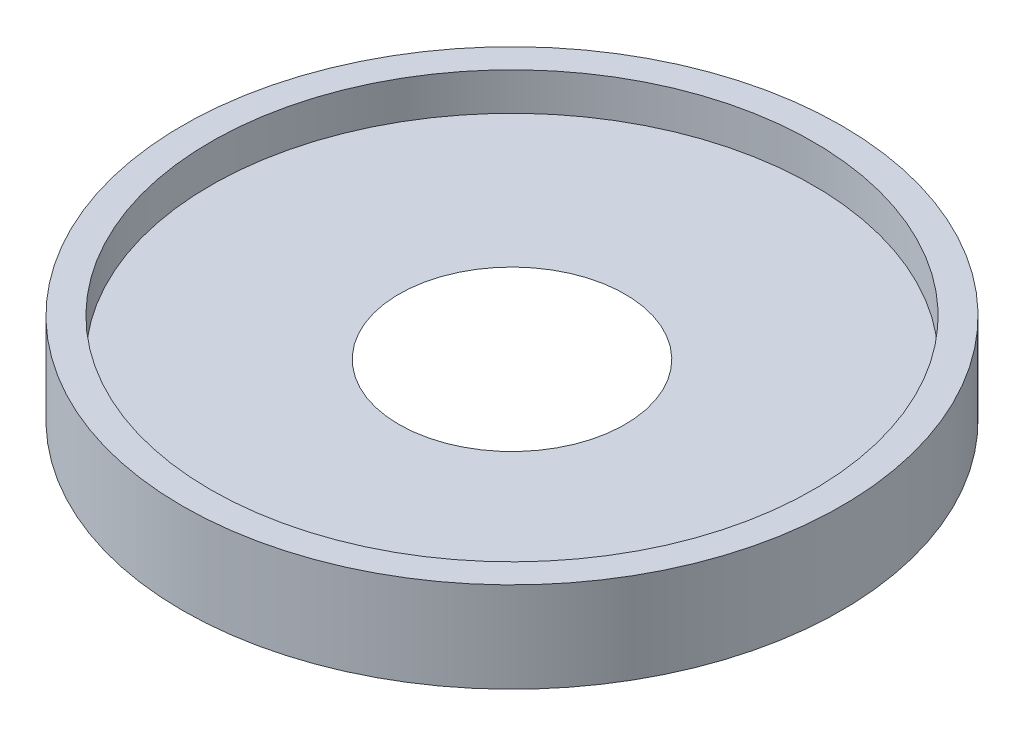
ISO-10303-21;
HEADER;
FILE_DESCRIPTION(('STEP AP214'),'2;1');
FILE_NAME('part.step','',(''),(''),'','','');
FILE_SCHEMA(('AUTOMOTIVE_DESIGN { 1 0 10303 214 1 1 1 1 }'));
ENDSEC;
DATA;
#1=APPLICATION_CONTEXT('core data for automotive mechanical design processes');
#2=APPLICATION_PROTOCOL_DEFINITION('international standard','automotive_design',2000,#1);
#3=PRODUCT_CONTEXT('',#1,'mechanical');
#4=PRODUCT('Part','Part','',(#3));
#5=PRODUCT_RELATED_PRODUCT_CATEGORY('part','',(#4));
#6=PRODUCT_DEFINITION_FORMATION('','',#4);
#7=PRODUCT_DEFINITION_CONTEXT('part definition',#1,'design');
#8=PRODUCT_DEFINITION('design','',#6,#7);
#9=PRODUCT_DEFINITION_SHAPE('','',#8);
#10=(LENGTH_UNIT() NAMED_UNIT(*) SI_UNIT(.MILLI.,.METRE.));
#11=(NAMED_UNIT(*) PLANE_ANGLE_UNIT() SI_UNIT($,.RADIAN.));
#12=(NAMED_UNIT(*) SI_UNIT($,.STERADIAN.) SOLID_ANGLE_UNIT());
#13=UNCERTAINTY_MEASURE_WITH_UNIT(LENGTH_MEASURE(1.E-05),#10,'distance_accuracy_value','');
#14=(GEOMETRIC_REPRESENTATION_CONTEXT(3) GLOBAL_UNCERTAINTY_ASSIGNED_CONTEXT((#13)) GLOBAL_UNIT_ASSIGNED_CONTEXT((#10,
#11,#12)) REPRESENTATION_CONTEXT('',''));
#15=CARTESIAN_POINT('',(0.,0.,0.));
#16=DIRECTION('',(0.,0.,1.));
#17=DIRECTION('',(1.,0.,0.));
#18=AXIS2_PLACEMENT_3D('',#15,#16,#17);
#19=CARTESIAN_POINT('',(0.,3.048,0.));
#20=DIRECTION('',(0.,-1.,0.));
#21=DIRECTION('',(0.,0.,-1.));
#22=AXIS2_PLACEMENT_3D('',#19,#20,#21);
#23=CYLINDRICAL_SURFACE('',#22,11.1125);
#24=CARTESIAN_POINT('',(0.,3.048,0.));
#25=DIRECTION('',(0.,1.,0.));
#26=DIRECTION('',(0.,0.,1.));
#27=AXIS2_PLACEMENT_3D('',#24,#25,#26);
#28=CIRCLE('',#27,11.1125);
#29=CARTESIAN_POINT('',(0.,3.048,-11.1125));
#30=VERTEX_POINT('',#29);
#31=EDGE_CURVE('E41',#30,#30,#28,.T.);
#32=CARTESIAN_POINT('',(0.,0.,0.));
#33=DIRECTION('',(0.,1.,0.));
#34=DIRECTION('',(0.,0.,1.));
#35=AXIS2_PLACEMENT_3D('',#32,#33,#34);
#36=CIRCLE('',#35,11.1125);
#37=CARTESIAN_POINT('',(0.,0.,-11.1125));
#38=VERTEX_POINT('',#37);
#39=EDGE_CURVE('E45',#38,#38,#36,.T.);
#40=CARTESIAN_POINT('',(0.,3.048,-11.1125));
#41=CARTESIAN_POINT('',(0.,3.01625,-11.1125));
#42=CARTESIAN_POINT('',(0.,2.9845,-11.1125));
#43=CARTESIAN_POINT('',(0.,2.921,-11.1125));
#44=CARTESIAN_POINT('',(0.,2.88925,-11.1125));
#45=CARTESIAN_POINT('',(0.,2.82575,-11.1125));
#46=CARTESIAN_POINT('',(0.,2.794,-11.1125));
#47=CARTESIAN_POINT('',(0.,2.7305,-11.1125));
#48=CARTESIAN_POINT('',(0.,2.69875,-11.1125));
#49=CARTESIAN_POINT('',(0.,2.63525,-11.1125));
#50=CARTESIAN_POINT('',(0.,2.6035,-11.1125));
#51=CARTESIAN_POINT('',(0.,2.54,-11.1125));
#52=CARTESIAN_POINT('',(0.,2.50825,-11.1125));
#53=CARTESIAN_POINT('',(0.,2.44475,-11.1125));
#54=CARTESIAN_POINT('',(0.,2.413,-11.1125));
#55=CARTESIAN_POINT('',(0.,2.3495,-11.1125));
#56=CARTESIAN_POINT('',(0.,2.31775,-11.1125));
#57=CARTESIAN_POINT('',(0.,2.25425,-11.1125));
#58=CARTESIAN_POINT('',(0.,2.2225,-11.1125));
#59=CARTESIAN_POINT('',(0.,2.159,-11.1125));
#60=CARTESIAN_POINT('',(0.,2.12725,-11.1125));
#61=CARTESIAN_POINT('',(0.,2.06375,-11.1125));
#62=CARTESIAN_POINT('',(0.,2.032,-11.1125));
#63=CARTESIAN_POINT('',(0.,1.9685,-11.1125));
#64=CARTESIAN_POINT('',(0.,1.93675,-11.1125));
#65=CARTESIAN_POINT('',(0.,1.87325,-11.1125));
#66=CARTESIAN_POINT('',(0.,1.8415,-11.1125));
#67=CARTESIAN_POINT('',(0.,1.778,-11.1125));
#68=CARTESIAN_POINT('',(0.,1.74625,-11.1125));
#69=CARTESIAN_POINT('',(0.,1.68275,-11.1125));
#70=CARTESIAN_POINT('',(0.,1.651,-11.1125));
#71=CARTESIAN_POINT('',(0.,1.5875,-11.1125));
#72=CARTESIAN_POINT('',(0.,1.55575,-11.1125));
#73=CARTESIAN_POINT('',(0.,1.49225,-11.1125));
#74=CARTESIAN_POINT('',(0.,1.4605,-11.1125));
#75=CARTESIAN_POINT('',(0.,1.397,-11.1125));
#76=CARTESIAN_POINT('',(0.,1.36525,-11.1125));
#77=CARTESIAN_POINT('',(0.,1.30175,-11.1125));
#78=CARTESIAN_POINT('',(0.,1.27,-11.1125));
#79=CARTESIAN_POINT('',(0.,1.2065,-11.1125));
#80=CARTESIAN_POINT('',(0.,1.17475,-11.1125));
#81=CARTESIAN_POINT('',(0.,1.11125,-11.1125));
#82=CARTESIAN_POINT('',(0.,1.0795,-11.1125));
#83=CARTESIAN_POINT('',(0.,1.016,-11.1125));
#84=CARTESIAN_POINT('',(0.,0.98425,-11.1125));
#85=CARTESIAN_POINT('',(0.,0.92075,-11.1125));
#86=CARTESIAN_POINT('',(0.,0.889,-11.1125));
#87=CARTESIAN_POINT('',(0.,0.8255,-11.1125));
#88=CARTESIAN_POINT('',(0.,0.79375,-11.1125));
#89=CARTESIAN_POINT('',(0.,0.73025,-11.1125));
#90=CARTESIAN_POINT('',(0.,0.6985,-11.1125));
#91=CARTESIAN_POINT('',(0.,0.635,-11.1125));
#92=CARTESIAN_POINT('',(0.,0.60325,-11.1125));
#93=CARTESIAN_POINT('',(0.,0.53975,-11.1125));
#94=CARTESIAN_POINT('',(0.,0.508,-11.1125));
#95=CARTESIAN_POINT('',(0.,0.4445,-11.1125));
#96=CARTESIAN_POINT('',(0.,0.41275,-11.1125));
#97=CARTESIAN_POINT('',(0.,0.34925,-11.1125));
#98=CARTESIAN_POINT('',(0.,0.3175,-11.1125));
#99=CARTESIAN_POINT('',(0.,0.254,-11.1125));
#100=CARTESIAN_POINT('',(0.,0.22225,-11.1125));
#101=CARTESIAN_POINT('',(0.,0.15875,-11.1125));
#102=CARTESIAN_POINT('',(0.,0.127,-11.1125));
#103=CARTESIAN_POINT('',(0.,0.0634999999999999,-11.1125));
#104=CARTESIAN_POINT('',(0.,0.03175,-11.1125));
#105=CARTESIAN_POINT('',(0.,0.,-11.1125));
#106=B_SPLINE_CURVE_WITH_KNOTS('',3,(#40,#41,#42,#43,#44,#45,#46,#47,#48,#49,#50,#51,#52,#53,
#54,#55,#56,#57,#58,#59,#60,#61,#62,#63,#64,#65,#66,#67,#68,#69,#70,#71,#72,#73,#74,#75,#76,#77,
#78,#79,#80,#81,#82,#83,#84,#85,#86,#87,#88,#89,#90,#91,#92,#93,#94,#95,#96,#97,#98,#99,#100,
#101,#102,#103,#104,#105),.UNSPECIFIED.,.F.,.F.,(4,2,2,2,2,2,2,2,2,2,2,2,2,2,2,2,2,2,2,2,2,2,2,
2,2,2,2,2,2,2,2,2,4),(0.,0.0952499999999998,0.1905,0.28575,0.381,0.47625,0.5715,0.66675,0.762,
0.85725,0.9525,1.04775,1.143,1.23825,1.3335,1.42875,1.524,1.61925,1.7145,1.80975,1.905,2.00025,
2.0955,2.19075,2.286,2.38125,2.4765,2.57175,2.667,2.76225,2.8575,2.95275,3.048),.UNSPECIFIED.);
#107=EDGE_CURVE('BSEAM34',#30,#38,#106,.T.);
#108=ORIENTED_EDGE('',*,*,#31,.F.);
#109=ORIENTED_EDGE('',*,*,#39,.T.);
#110=ORIENTED_EDGE('',*,*,#107,.T.);
#111=ORIENTED_EDGE('',*,*,#107,.F.);
#112=EDGE_LOOP('',(#108,#110,#109,#111));
#113=FACE_BOUND('',#112,.T.);
#114=ADVANCED_FACE('F34',(#113),#23,.T.);
#115=CARTESIAN_POINT('',(0.,3.048,0.));
#116=DIRECTION('',(0.,1.,0.));
#117=DIRECTION('',(0.,0.,1.));
#118=AXIS2_PLACEMENT_3D('',#115,#116,#117);
#119=PLANE('',#118);
#120=CARTESIAN_POINT('',(0.,3.048,0.));
#121=DIRECTION('',(0.,1.,0.));
#122=DIRECTION('',(0.,0.,1.));
#123=AXIS2_PLACEMENT_3D('',#120,#121,#122);
#124=CIRCLE('',#123,10.16);
#125=CARTESIAN_POINT('',(0.,3.048,10.16));
#126=VERTEX_POINT('',#125);
#127=EDGE_CURVE('E53',#126,#126,#124,.T.);
#128=ORIENTED_EDGE('',*,*,#127,.F.);
#129=EDGE_LOOP('',(#128));
#130=FACE_BOUND('',#129,.T.);
#131=ORIENTED_EDGE('',*,*,#31,.T.);
#132=EDGE_LOOP('',(#131));
#133=FACE_BOUND('',#132,.T.);
#134=ADVANCED_FACE('F77',(#130,#133),#119,.T.);
#135=CARTESIAN_POINT('',(0.,0.,0.));
#136=DIRECTION('',(0.,1.,0.));
#137=DIRECTION('',(0.,0.,1.));
#138=AXIS2_PLACEMENT_3D('',#135,#136,#137);
#139=PLANE('',#138);
#140=CARTESIAN_POINT('',(0.,0.,0.));
#141=DIRECTION('',(0.,1.,0.));
#142=DIRECTION('',(0.,0.,1.));
#143=AXIS2_PLACEMENT_3D('',#140,#141,#142);
#144=CIRCLE('',#143,9.55174851417232);
#145=CARTESIAN_POINT('',(0.,0.,9.55174851417232));
#146=VERTEX_POINT('',#145);
#147=EDGE_CURVE('E10',#146,#146,#144,.T.);
#148=ORIENTED_EDGE('',*,*,#147,.T.);
#149=EDGE_LOOP('',(#148));
#150=FACE_BOUND('',#149,.T.);
#151=ORIENTED_EDGE('',*,*,#39,.F.);
#152=EDGE_LOOP('',(#151));
#153=FACE_BOUND('',#152,.T.);
#154=ADVANCED_FACE('F69',(#150,#153),#139,.F.);
#155=CARTESIAN_POINT('',(0.,1.778,0.));
#156=DIRECTION('',(0.,1.,0.));
#157=DIRECTION('',(0.,0.,1.));
#158=AXIS2_PLACEMENT_3D('',#155,#156,#157);
#159=CYLINDRICAL_SURFACE('',#158,10.16);
#160=CARTESIAN_POINT('',(0.,1.778,0.));
#161=DIRECTION('',(0.,1.,0.));
#162=DIRECTION('',(0.,0.,1.));
#163=AXIS2_PLACEMENT_3D('',#160,#161,#162);
#164=CIRCLE('',#163,10.16);
#165=CARTESIAN_POINT('',(0.,1.778,10.16));
#166=VERTEX_POINT('',#165);
#167=EDGE_CURVE('E50',#166,#166,#164,.T.);
#168=ORIENTED_EDGE('',*,*,#167,.F.);
#169=EDGE_LOOP('',(#168));
#170=FACE_BOUND('',#169,.T.);
#171=ORIENTED_EDGE('',*,*,#127,.T.);
#172=EDGE_LOOP('',(#171));
#173=FACE_BOUND('',#172,.T.);
#174=ADVANCED_FACE('F67',(#170,#173),#159,.F.);
#175=CARTESIAN_POINT('',(0.,1.778,0.));
#176=DIRECTION('',(0.,1.,0.));
#177=DIRECTION('',(0.,0.,1.));
#178=AXIS2_PLACEMENT_3D('',#175,#176,#177);
#179=PLANE('',#178);
#180=CARTESIAN_POINT('',(0.,1.778,0.));
#181=DIRECTION('',(0.,1.,0.));
#182=DIRECTION('',(0.,0.,1.));
#183=AXIS2_PLACEMENT_3D('',#180,#181,#182);
#184=CIRCLE('',#183,3.81);
#185=CARTESIAN_POINT('',(0.,1.778,3.81));
#186=VERTEX_POINT('',#185);
#187=EDGE_CURVE('E55',#186,#186,#184,.T.);
#188=ORIENTED_EDGE('',*,*,#187,.F.);
#189=EDGE_LOOP('',(#188));
#190=FACE_BOUND('',#189,.T.);
#191=ORIENTED_EDGE('',*,*,#167,.T.);
#192=EDGE_LOOP('',(#191));
#193=FACE_BOUND('',#192,.T.);
#194=ADVANCED_FACE('F65',(#190,#193),#179,.T.);
#195=CARTESIAN_POINT('',(0.,10.16,0.));
#196=DIRECTION('',(0.,1.,0.));
#197=DIRECTION('',(0.,0.,1.));
#198=AXIS2_PLACEMENT_3D('',#195,#196,#197);
#199=DEGENERATE_TOROIDAL_SURFACE('',#198,9.55174851417232,10.16,.T.);
#200=ORIENTED_EDGE('',*,*,#147,.F.);
#201=EDGE_LOOP('',(#200));
#202=FACE_BOUND('',#201,.T.);
#203=ORIENTED_EDGE('',*,*,#187,.T.);
#204=EDGE_LOOP('',(#203));
#205=FACE_BOUND('',#204,.T.);
#206=ADVANCED_FACE('F36',(#202,#205),#199,.T.);
#207=CLOSED_SHELL('',(#114,#134,#154,#174,#194,#206));
#208=MANIFOLD_SOLID_BREP('B2',#207);
#209=ADVANCED_BREP_SHAPE_REPRESENTATION('',(#18,#208),#14);
#210=SHAPE_DEFINITION_REPRESENTATION(#9,#209);
ENDSEC;
END-ISO-10303-21;
